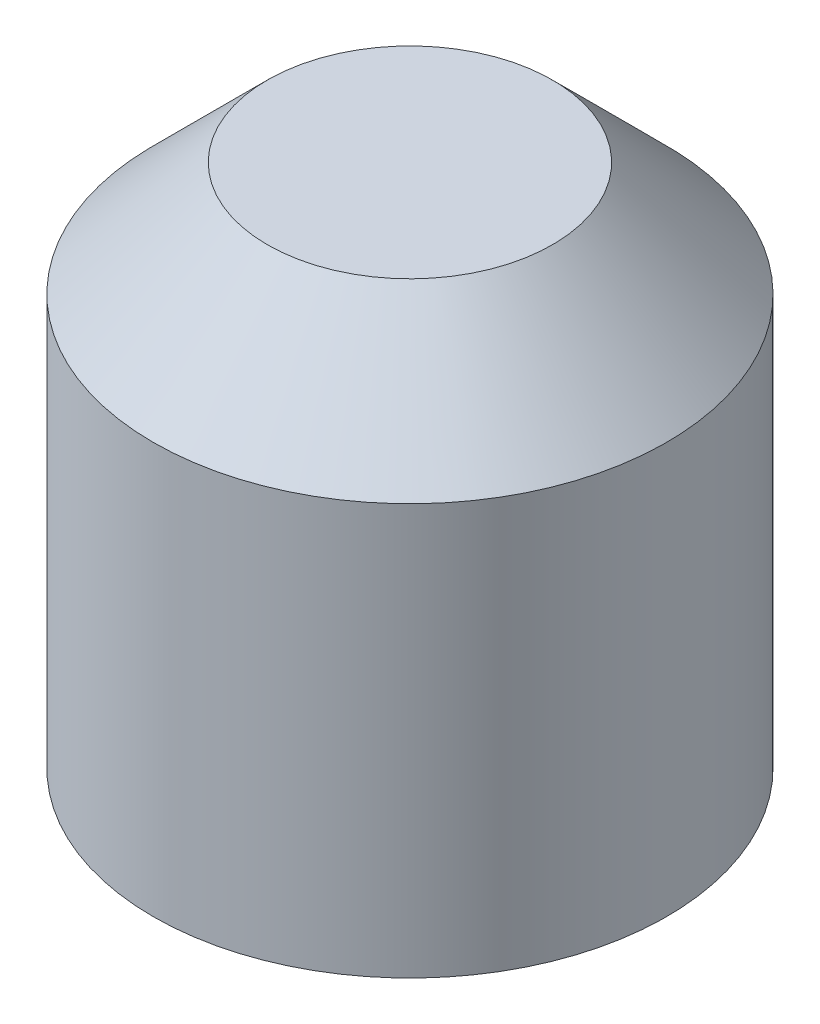
ISO-10303-21;
HEADER;
FILE_DESCRIPTION(('STEP AP214'),'2;1');
FILE_NAME('part.step','',(''),(''),'','','');
FILE_SCHEMA(('AUTOMOTIVE_DESIGN { 1 0 10303 214 1 1 1 1 }'));
ENDSEC;
DATA;
#1=APPLICATION_CONTEXT('core data for automotive mechanical design processes');
#2=APPLICATION_PROTOCOL_DEFINITION('international standard','automotive_design',2000,#1);
#3=PRODUCT_CONTEXT('',#1,'mechanical');
#4=PRODUCT('Part','Part','',(#3));
#5=PRODUCT_RELATED_PRODUCT_CATEGORY('part','',(#4));
#6=PRODUCT_DEFINITION_FORMATION('','',#4);
#7=PRODUCT_DEFINITION_CONTEXT('part definition',#1,'design');
#8=PRODUCT_DEFINITION('design','',#6,#7);
#9=PRODUCT_DEFINITION_SHAPE('','',#8);
#10=(LENGTH_UNIT() NAMED_UNIT(*) SI_UNIT(.MILLI.,.METRE.));
#11=(NAMED_UNIT(*) PLANE_ANGLE_UNIT() SI_UNIT($,.RADIAN.));
#12=(NAMED_UNIT(*) SI_UNIT($,.STERADIAN.) SOLID_ANGLE_UNIT());
#13=UNCERTAINTY_MEASURE_WITH_UNIT(LENGTH_MEASURE(1.E-05),#10,'distance_accuracy_value','');
#14=(GEOMETRIC_REPRESENTATION_CONTEXT(3) GLOBAL_UNCERTAINTY_ASSIGNED_CONTEXT((#13)) GLOBAL_UNIT_ASSIGNED_CONTEXT((#10,
#11,#12)) REPRESENTATION_CONTEXT('',''));
#15=CARTESIAN_POINT('',(0.,0.,0.));
#16=DIRECTION('',(0.,0.,1.));
#17=DIRECTION('',(1.,0.,0.));
#18=AXIS2_PLACEMENT_3D('',#15,#16,#17);
#19=CARTESIAN_POINT('',(0.,92.,0.));
#20=DIRECTION('',(0.,-1.,0.));
#21=DIRECTION('',(0.,0.,-1.));
#22=AXIS2_PLACEMENT_3D('',#19,#20,#21);
#23=CYLINDRICAL_SURFACE('',#22,45.);
#24=CARTESIAN_POINT('',(0.,71.9999999999999,0.));
#25=DIRECTION('',(0.,1.,0.));
#26=DIRECTION('',(0.,0.,1.));
#27=AXIS2_PLACEMENT_3D('',#24,#25,#26);
#28=CIRCLE('',#27,45.);
#29=CARTESIAN_POINT('',(0.,71.9999999999999,45.));
#30=VERTEX_POINT('',#29);
#31=EDGE_CURVE('E10',#30,#30,#28,.F.);
#32=ORIENTED_EDGE('',*,*,#31,.T.);
#33=EDGE_LOOP('',(#32));
#34=FACE_BOUND('',#33,.T.);
#35=CARTESIAN_POINT('',(0.,0.,0.));
#36=DIRECTION('',(0.,1.,0.));
#37=DIRECTION('',(0.,0.,1.));
#38=AXIS2_PLACEMENT_3D('',#35,#36,#37);
#39=CIRCLE('',#38,45.);
#40=CARTESIAN_POINT('',(0.,0.,45.));
#41=VERTEX_POINT('',#40);
#42=EDGE_CURVE('E55',#41,#41,#39,.T.);
#43=ORIENTED_EDGE('',*,*,#42,.T.);
#44=EDGE_LOOP('',(#43));
#45=FACE_BOUND('',#44,.T.);
#46=ADVANCED_FACE('F43',(#34,#45),#23,.T.);
#47=CARTESIAN_POINT('',(0.,92.,0.));
#48=DIRECTION('',(0.,1.,0.));
#49=DIRECTION('',(0.,0.,1.));
#50=AXIS2_PLACEMENT_3D('',#47,#48,#49);
#51=PLANE('',#50);
#52=CARTESIAN_POINT('',(0.,92.,0.));
#53=DIRECTION('',(0.,1.,0.));
#54=DIRECTION('',(0.,0.,1.));
#55=AXIS2_PLACEMENT_3D('',#52,#53,#54);
#56=CIRCLE('',#55,25.);
#57=CARTESIAN_POINT('',(0.,92.,25.));
#58=VERTEX_POINT('',#57);
#59=EDGE_CURVE('E51',#58,#58,#56,.T.);
#60=ORIENTED_EDGE('',*,*,#59,.T.);
#61=EDGE_LOOP('',(#60));
#62=FACE_BOUND('',#61,.T.);
#63=ADVANCED_FACE('F65',(#62),#51,.T.);
#64=CARTESIAN_POINT('',(0.,0.,0.));
#65=DIRECTION('',(0.,1.,0.));
#66=DIRECTION('',(0.,0.,1.));
#67=AXIS2_PLACEMENT_3D('',#64,#65,#66);
#68=PLANE('',#67);
#69=ORIENTED_EDGE('',*,*,#42,.F.);
#70=EDGE_LOOP('',(#69));
#71=FACE_BOUND('',#70,.T.);
#72=ADVANCED_FACE('F63',(#71),#68,.F.);
#73=CARTESIAN_POINT('',(0.,92.,0.));
#74=DIRECTION('',(0.,-1.,0.));
#75=DIRECTION('',(0.,0.,-1.));
#76=AXIS2_PLACEMENT_3D('',#73,#74,#75);
#77=CONICAL_SURFACE('',#76,25.,0.785398163397447);
#78=ORIENTED_EDGE('',*,*,#31,.F.);
#79=EDGE_LOOP('',(#78));
#80=FACE_BOUND('',#79,.T.);
#81=ORIENTED_EDGE('',*,*,#59,.F.);
#82=EDGE_LOOP('',(#81));
#83=FACE_BOUND('',#82,.T.);
#84=ADVANCED_FACE('F46',(#80,#83),#77,.T.);
#85=CLOSED_SHELL('',(#46,#63,#72,#84));
#86=MANIFOLD_SOLID_BREP('B2',#85);
#87=ADVANCED_BREP_SHAPE_REPRESENTATION('',(#18,#86),#14);
#88=SHAPE_DEFINITION_REPRESENTATION(#9,#87);
ENDSEC;
END-ISO-10303-21;
